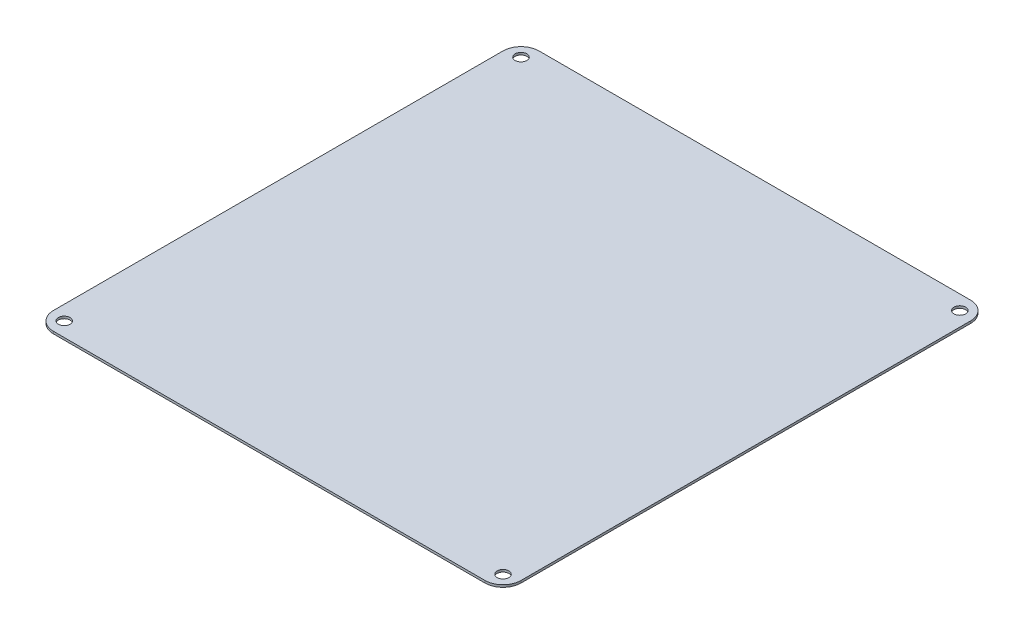
ISO-10303-21;
HEADER;
FILE_DESCRIPTION(('STEP AP214'),'2;1');
FILE_NAME('part.step','',(''),(''),'','','');
FILE_SCHEMA(('AUTOMOTIVE_DESIGN { 1 0 10303 214 1 1 1 1 }'));
ENDSEC;
DATA;
#1=APPLICATION_CONTEXT('core data for automotive mechanical design processes');
#2=APPLICATION_PROTOCOL_DEFINITION('international standard','automotive_design',2000,#1);
#3=PRODUCT_CONTEXT('',#1,'mechanical');
#4=PRODUCT('Part','Part','',(#3));
#5=PRODUCT_RELATED_PRODUCT_CATEGORY('part','',(#4));
#6=PRODUCT_DEFINITION_FORMATION('','',#4);
#7=PRODUCT_DEFINITION_CONTEXT('part definition',#1,'design');
#8=PRODUCT_DEFINITION('design','',#6,#7);
#9=PRODUCT_DEFINITION_SHAPE('','',#8);
#10=(LENGTH_UNIT() NAMED_UNIT(*) SI_UNIT(.MILLI.,.METRE.));
#11=(NAMED_UNIT(*) PLANE_ANGLE_UNIT() SI_UNIT($,.RADIAN.));
#12=(NAMED_UNIT(*) SI_UNIT($,.STERADIAN.) SOLID_ANGLE_UNIT());
#13=UNCERTAINTY_MEASURE_WITH_UNIT(LENGTH_MEASURE(1.E-05),#10,'distance_accuracy_value','');
#14=(GEOMETRIC_REPRESENTATION_CONTEXT(3) GLOBAL_UNCERTAINTY_ASSIGNED_CONTEXT((#13)) GLOBAL_UNIT_ASSIGNED_CONTEXT((#10,
#11,#12)) REPRESENTATION_CONTEXT('',''));
#15=CARTESIAN_POINT('',(0.,0.,0.));
#16=DIRECTION('',(0.,0.,1.));
#17=DIRECTION('',(1.,0.,0.));
#18=AXIS2_PLACEMENT_3D('',#15,#16,#17);
#19=CARTESIAN_POINT('',(-130.,1.27,135.));
#20=DIRECTION('',(1.,0.,0.));
#21=DIRECTION('',(0.,0.,-1.));
#22=AXIS2_PLACEMENT_3D('',#19,#20,#21);
#23=PLANE('',#22);
#24=DIRECTION('',(0.,0.,1.));
#25=VECTOR('',#24,1.);
#26=CARTESIAN_POINT('',(-130.,0.,135.));
#27=LINE('',#26,#25);
#28=CARTESIAN_POINT('',(-130.,0.,-125.));
#29=VERTEX_POINT('',#28);
#30=CARTESIAN_POINT('',(-130.,0.,125.));
#31=VERTEX_POINT('',#30);
#32=EDGE_CURVE('E130',#29,#31,#27,.T.);
#33=ORIENTED_EDGE('',*,*,#32,.T.);
#34=DIRECTION('',(0.,-1.,0.));
#35=VECTOR('',#34,1.);
#36=CARTESIAN_POINT('',(-130.,1.27,125.));
#37=LINE('',#36,#35);
#38=CARTESIAN_POINT('',(-130.,1.27,125.));
#39=VERTEX_POINT('',#38);
#40=EDGE_CURVE('E152',#31,#39,#37,.F.);
#41=ORIENTED_EDGE('',*,*,#40,.T.);
#42=DIRECTION('',(0.,0.,1.));
#43=VECTOR('',#42,1.);
#44=CARTESIAN_POINT('',(-130.,1.27,135.));
#45=LINE('',#44,#43);
#46=CARTESIAN_POINT('',(-130.,1.27,-125.));
#47=VERTEX_POINT('',#46);
#48=EDGE_CURVE('E128',#47,#39,#45,.T.);
#49=ORIENTED_EDGE('',*,*,#48,.F.);
#50=DIRECTION('',(0.,-1.,0.));
#51=VECTOR('',#50,1.);
#52=CARTESIAN_POINT('',(-130.,1.27,-125.));
#53=LINE('',#52,#51);
#54=EDGE_CURVE('E149',#47,#29,#53,.T.);
#55=ORIENTED_EDGE('',*,*,#54,.T.);
#56=EDGE_LOOP('',(#33,#41,#49,#55));
#57=FACE_BOUND('',#56,.T.);
#58=ADVANCED_FACE('F33',(#57),#23,.F.);
#59=CARTESIAN_POINT('',(130.,1.27,135.));
#60=DIRECTION('',(0.,0.,-1.));
#61=DIRECTION('',(-1.,0.,0.));
#62=AXIS2_PLACEMENT_3D('',#59,#60,#61);
#63=PLANE('',#62);
#64=DIRECTION('',(1.,0.,0.));
#65=VECTOR('',#64,1.);
#66=CARTESIAN_POINT('',(130.,0.,135.));
#67=LINE('',#66,#65);
#68=CARTESIAN_POINT('',(-120.,0.,135.));
#69=VERTEX_POINT('',#68);
#70=CARTESIAN_POINT('',(120.,0.,135.));
#71=VERTEX_POINT('',#70);
#72=EDGE_CURVE('E126',#69,#71,#67,.T.);
#73=ORIENTED_EDGE('',*,*,#72,.T.);
#74=DIRECTION('',(0.,-1.,0.));
#75=VECTOR('',#74,1.);
#76=CARTESIAN_POINT('',(120.,1.27,135.));
#77=LINE('',#76,#75);
#78=CARTESIAN_POINT('',(120.,1.27,135.));
#79=VERTEX_POINT('',#78);
#80=EDGE_CURVE('E104',#71,#79,#77,.F.);
#81=ORIENTED_EDGE('',*,*,#80,.T.);
#82=DIRECTION('',(1.,0.,0.));
#83=VECTOR('',#82,1.);
#84=CARTESIAN_POINT('',(130.,1.27,135.));
#85=LINE('',#84,#83);
#86=CARTESIAN_POINT('',(-120.,1.27,135.));
#87=VERTEX_POINT('',#86);
#88=EDGE_CURVE('E166',#87,#79,#85,.T.);
#89=ORIENTED_EDGE('',*,*,#88,.F.);
#90=DIRECTION('',(0.,-1.,0.));
#91=VECTOR('',#90,1.);
#92=CARTESIAN_POINT('',(-120.,1.27,135.));
#93=LINE('',#92,#91);
#94=EDGE_CURVE('E109',#87,#69,#93,.T.);
#95=ORIENTED_EDGE('',*,*,#94,.T.);
#96=EDGE_LOOP('',(#73,#81,#89,#95));
#97=FACE_BOUND('',#96,.T.);
#98=ADVANCED_FACE('F171',(#97),#63,.F.);
#99=CARTESIAN_POINT('',(130.,1.27,135.));
#100=DIRECTION('',(-1.,0.,0.));
#101=DIRECTION('',(0.,0.,1.));
#102=AXIS2_PLACEMENT_3D('',#99,#100,#101);
#103=PLANE('',#102);
#104=DIRECTION('',(0.,0.,-1.));
#105=VECTOR('',#104,1.);
#106=CARTESIAN_POINT('',(130.,1.27,135.));
#107=LINE('',#106,#105);
#108=CARTESIAN_POINT('',(130.,1.27,125.));
#109=VERTEX_POINT('',#108);
#110=CARTESIAN_POINT('',(130.,1.27,-125.));
#111=VERTEX_POINT('',#110);
#112=EDGE_CURVE('E118',#109,#111,#107,.T.);
#113=ORIENTED_EDGE('',*,*,#112,.F.);
#114=DIRECTION('',(0.,-1.,0.));
#115=VECTOR('',#114,1.);
#116=CARTESIAN_POINT('',(130.,1.27,125.));
#117=LINE('',#116,#115);
#118=CARTESIAN_POINT('',(130.,0.,125.));
#119=VERTEX_POINT('',#118);
#120=EDGE_CURVE('E103',#109,#119,#117,.T.);
#121=ORIENTED_EDGE('',*,*,#120,.T.);
#122=DIRECTION('',(0.,0.,-1.));
#123=VECTOR('',#122,1.);
#124=CARTESIAN_POINT('',(130.,0.,135.));
#125=LINE('',#124,#123);
#126=CARTESIAN_POINT('',(130.,0.,-125.));
#127=VERTEX_POINT('',#126);
#128=EDGE_CURVE('E116',#119,#127,#125,.T.);
#129=ORIENTED_EDGE('',*,*,#128,.T.);
#130=DIRECTION('',(0.,-1.,0.));
#131=VECTOR('',#130,1.);
#132=CARTESIAN_POINT('',(130.,1.27,-125.));
#133=LINE('',#132,#131);
#134=EDGE_CURVE('E120',#127,#111,#133,.F.);
#135=ORIENTED_EDGE('',*,*,#134,.T.);
#136=EDGE_LOOP('',(#113,#121,#129,#135));
#137=FACE_BOUND('',#136,.T.);
#138=ADVANCED_FACE('F115',(#137),#103,.F.);
#139=CARTESIAN_POINT('',(130.,1.27,-135.));
#140=DIRECTION('',(0.,0.,1.));
#141=DIRECTION('',(1.,0.,0.));
#142=AXIS2_PLACEMENT_3D('',#139,#140,#141);
#143=PLANE('',#142);
#144=DIRECTION('',(-1.,0.,0.));
#145=VECTOR('',#144,1.);
#146=CARTESIAN_POINT('',(130.,1.27,-135.));
#147=LINE('',#146,#145);
#148=CARTESIAN_POINT('',(120.,1.27,-135.));
#149=VERTEX_POINT('',#148);
#150=CARTESIAN_POINT('',(-120.,1.27,-135.));
#151=VERTEX_POINT('',#150);
#152=EDGE_CURVE('E134',#149,#151,#147,.T.);
#153=ORIENTED_EDGE('',*,*,#152,.F.);
#154=DIRECTION('',(0.,-1.,0.));
#155=VECTOR('',#154,1.);
#156=CARTESIAN_POINT('',(120.,1.27,-135.));
#157=LINE('',#156,#155);
#158=CARTESIAN_POINT('',(120.,0.,-135.));
#159=VERTEX_POINT('',#158);
#160=EDGE_CURVE('E11',#149,#159,#157,.T.);
#161=ORIENTED_EDGE('',*,*,#160,.T.);
#162=DIRECTION('',(-1.,0.,0.));
#163=VECTOR('',#162,1.);
#164=CARTESIAN_POINT('',(130.,0.,-135.));
#165=LINE('',#164,#163);
#166=CARTESIAN_POINT('',(-120.,0.,-135.));
#167=VERTEX_POINT('',#166);
#168=EDGE_CURVE('E125',#159,#167,#165,.T.);
#169=ORIENTED_EDGE('',*,*,#168,.T.);
#170=DIRECTION('',(0.,-1.,0.));
#171=VECTOR('',#170,1.);
#172=CARTESIAN_POINT('',(-120.,1.27,-135.));
#173=LINE('',#172,#171);
#174=EDGE_CURVE('E41',#167,#151,#173,.F.);
#175=ORIENTED_EDGE('',*,*,#174,.T.);
#176=EDGE_LOOP('',(#153,#161,#169,#175));
#177=FACE_BOUND('',#176,.T.);
#178=ADVANCED_FACE('F213',(#177),#143,.F.);
#179=CARTESIAN_POINT('',(0.,1.27,0.));
#180=DIRECTION('',(0.,1.,0.));
#181=DIRECTION('',(0.,0.,1.));
#182=AXIS2_PLACEMENT_3D('',#179,#180,#181);
#183=PLANE('',#182);
#184=CARTESIAN_POINT('',(-122.,1.27,127.));
#185=DIRECTION('',(0.,1.,0.));
#186=DIRECTION('',(0.,0.,1.));
#187=AXIS2_PLACEMENT_3D('',#184,#185,#186);
#188=CIRCLE('',#187,3.25000000000001);
#189=CARTESIAN_POINT('',(-122.,1.27,130.25));
#190=VERTEX_POINT('',#189);
#191=EDGE_CURVE('E183',#190,#190,#188,.T.);
#192=ORIENTED_EDGE('',*,*,#191,.F.);
#193=EDGE_LOOP('',(#192));
#194=FACE_BOUND('',#193,.T.);
#195=CARTESIAN_POINT('',(122.,1.27,127.));
#196=DIRECTION('',(0.,1.,0.));
#197=DIRECTION('',(0.,0.,1.));
#198=AXIS2_PLACEMENT_3D('',#195,#196,#197);
#199=CIRCLE('',#198,3.25000000000001);
#200=CARTESIAN_POINT('',(122.,1.27,130.25));
#201=VERTEX_POINT('',#200);
#202=EDGE_CURVE('E189',#201,#201,#199,.T.);
#203=ORIENTED_EDGE('',*,*,#202,.F.);
#204=EDGE_LOOP('',(#203));
#205=FACE_BOUND('',#204,.T.);
#206=CARTESIAN_POINT('',(122.,1.27,-127.));
#207=DIRECTION('',(0.,1.,0.));
#208=DIRECTION('',(0.,0.,1.));
#209=AXIS2_PLACEMENT_3D('',#206,#207,#208);
#210=CIRCLE('',#209,3.25000000000002);
#211=CARTESIAN_POINT('',(122.,1.27,-123.75));
#212=VERTEX_POINT('',#211);
#213=EDGE_CURVE('E195',#212,#212,#210,.T.);
#214=ORIENTED_EDGE('',*,*,#213,.F.);
#215=EDGE_LOOP('',(#214));
#216=FACE_BOUND('',#215,.T.);
#217=CARTESIAN_POINT('',(-122.,1.27,-127.));
#218=DIRECTION('',(0.,1.,0.));
#219=DIRECTION('',(0.,0.,1.));
#220=AXIS2_PLACEMENT_3D('',#217,#218,#219);
#221=CIRCLE('',#220,3.25000000000001);
#222=CARTESIAN_POINT('',(-122.,1.27,-123.75));
#223=VERTEX_POINT('',#222);
#224=EDGE_CURVE('E174',#223,#223,#221,.T.);
#225=ORIENTED_EDGE('',*,*,#224,.F.);
#226=EDGE_LOOP('',(#225));
#227=FACE_BOUND('',#226,.T.);
#228=ORIENTED_EDGE('',*,*,#88,.T.);
#229=CARTESIAN_POINT('',(120.,1.27,125.));
#230=DIRECTION('',(0.,1.,0.));
#231=DIRECTION('',(0.,0.,1.));
#232=AXIS2_PLACEMENT_3D('',#229,#230,#231);
#233=CIRCLE('',#232,10.);
#234=EDGE_CURVE('E147',#79,#109,#233,.T.);
#235=ORIENTED_EDGE('',*,*,#234,.T.);
#236=ORIENTED_EDGE('',*,*,#112,.T.);
#237=CARTESIAN_POINT('',(120.,1.27,-125.));
#238=DIRECTION('',(0.,1.,0.));
#239=DIRECTION('',(0.,0.,1.));
#240=AXIS2_PLACEMENT_3D('',#237,#238,#239);
#241=CIRCLE('',#240,10.);
#242=EDGE_CURVE('E54',#111,#149,#241,.T.);
#243=ORIENTED_EDGE('',*,*,#242,.T.);
#244=ORIENTED_EDGE('',*,*,#152,.T.);
#245=CARTESIAN_POINT('',(-120.,1.27,-125.));
#246=DIRECTION('',(0.,1.,0.));
#247=DIRECTION('',(0.,0.,1.));
#248=AXIS2_PLACEMENT_3D('',#245,#246,#247);
#249=CIRCLE('',#248,10.);
#250=EDGE_CURVE('E142',#151,#47,#249,.T.);
#251=ORIENTED_EDGE('',*,*,#250,.T.);
#252=ORIENTED_EDGE('',*,*,#48,.T.);
#253=CARTESIAN_POINT('',(-120.,1.27,125.));
#254=DIRECTION('',(0.,1.,0.));
#255=DIRECTION('',(0.,0.,1.));
#256=AXIS2_PLACEMENT_3D('',#253,#254,#255);
#257=CIRCLE('',#256,10.);
#258=EDGE_CURVE('E145',#39,#87,#257,.T.);
#259=ORIENTED_EDGE('',*,*,#258,.T.);
#260=EDGE_LOOP('',(#228,#235,#236,#243,#244,#251,#252,#259));
#261=FACE_BOUND('',#260,.T.);
#262=ADVANCED_FACE('F163',(#194,#205,#216,#227,#261),#183,.T.);
#263=CARTESIAN_POINT('',(0.,0.,0.));
#264=DIRECTION('',(0.,1.,0.));
#265=DIRECTION('',(0.,0.,1.));
#266=AXIS2_PLACEMENT_3D('',#263,#264,#265);
#267=PLANE('',#266);
#268=CARTESIAN_POINT('',(-122.,0.,127.));
#269=DIRECTION('',(0.,1.,0.));
#270=DIRECTION('',(0.,0.,1.));
#271=AXIS2_PLACEMENT_3D('',#268,#269,#270);
#272=CIRCLE('',#271,3.25000000000001);
#273=CARTESIAN_POINT('',(-122.,0.,130.25));
#274=VERTEX_POINT('',#273);
#275=EDGE_CURVE('E186',#274,#274,#272,.T.);
#276=ORIENTED_EDGE('',*,*,#275,.T.);
#277=EDGE_LOOP('',(#276));
#278=FACE_BOUND('',#277,.T.);
#279=CARTESIAN_POINT('',(122.,0.,127.));
#280=DIRECTION('',(0.,1.,0.));
#281=DIRECTION('',(0.,0.,1.));
#282=AXIS2_PLACEMENT_3D('',#279,#280,#281);
#283=CIRCLE('',#282,3.25000000000001);
#284=CARTESIAN_POINT('',(122.,0.,130.25));
#285=VERTEX_POINT('',#284);
#286=EDGE_CURVE('E192',#285,#285,#283,.T.);
#287=ORIENTED_EDGE('',*,*,#286,.T.);
#288=EDGE_LOOP('',(#287));
#289=FACE_BOUND('',#288,.T.);
#290=CARTESIAN_POINT('',(122.,0.,-127.));
#291=DIRECTION('',(0.,1.,0.));
#292=DIRECTION('',(0.,0.,1.));
#293=AXIS2_PLACEMENT_3D('',#290,#291,#292);
#294=CIRCLE('',#293,3.25000000000002);
#295=CARTESIAN_POINT('',(122.,0.,-123.75));
#296=VERTEX_POINT('',#295);
#297=EDGE_CURVE('E181',#296,#296,#294,.T.);
#298=ORIENTED_EDGE('',*,*,#297,.T.);
#299=EDGE_LOOP('',(#298));
#300=FACE_BOUND('',#299,.T.);
#301=CARTESIAN_POINT('',(-122.,0.,-127.));
#302=DIRECTION('',(0.,1.,0.));
#303=DIRECTION('',(0.,0.,1.));
#304=AXIS2_PLACEMENT_3D('',#301,#302,#303);
#305=CIRCLE('',#304,3.25000000000001);
#306=CARTESIAN_POINT('',(-122.,0.,-123.75));
#307=VERTEX_POINT('',#306);
#308=EDGE_CURVE('E172',#307,#307,#305,.T.);
#309=ORIENTED_EDGE('',*,*,#308,.T.);
#310=EDGE_LOOP('',(#309));
#311=FACE_BOUND('',#310,.T.);
#312=ORIENTED_EDGE('',*,*,#128,.F.);
#313=CARTESIAN_POINT('',(120.,0.,125.));
#314=DIRECTION('',(0.,1.,0.));
#315=DIRECTION('',(0.,0.,1.));
#316=AXIS2_PLACEMENT_3D('',#313,#314,#315);
#317=CIRCLE('',#316,10.);
#318=EDGE_CURVE('E99',#119,#71,#317,.F.);
#319=ORIENTED_EDGE('',*,*,#318,.T.);
#320=ORIENTED_EDGE('',*,*,#72,.F.);
#321=CARTESIAN_POINT('',(-120.,0.,125.));
#322=DIRECTION('',(0.,1.,0.));
#323=DIRECTION('',(0.,0.,1.));
#324=AXIS2_PLACEMENT_3D('',#321,#322,#323);
#325=CIRCLE('',#324,10.);
#326=EDGE_CURVE('E110',#69,#31,#325,.F.);
#327=ORIENTED_EDGE('',*,*,#326,.T.);
#328=ORIENTED_EDGE('',*,*,#32,.F.);
#329=CARTESIAN_POINT('',(-120.,0.,-125.));
#330=DIRECTION('',(0.,1.,0.));
#331=DIRECTION('',(0.,0.,1.));
#332=AXIS2_PLACEMENT_3D('',#329,#330,#331);
#333=CIRCLE('',#332,10.);
#334=EDGE_CURVE('E119',#29,#167,#333,.F.);
#335=ORIENTED_EDGE('',*,*,#334,.T.);
#336=ORIENTED_EDGE('',*,*,#168,.F.);
#337=CARTESIAN_POINT('',(120.,0.,-125.));
#338=DIRECTION('',(0.,1.,0.));
#339=DIRECTION('',(0.,0.,1.));
#340=AXIS2_PLACEMENT_3D('',#337,#338,#339);
#341=CIRCLE('',#340,10.);
#342=EDGE_CURVE('E124',#159,#127,#341,.F.);
#343=ORIENTED_EDGE('',*,*,#342,.T.);
#344=EDGE_LOOP('',(#312,#319,#320,#327,#328,#335,#336,#343));
#345=FACE_BOUND('',#344,.T.);
#346=ADVANCED_FACE('F122',(#278,#289,#300,#311,#345),#267,.F.);
#347=CARTESIAN_POINT('',(-122.,0.,-127.));
#348=DIRECTION('',(0.,1.,0.));
#349=DIRECTION('',(0.,0.,1.));
#350=AXIS2_PLACEMENT_3D('',#347,#348,#349);
#351=CYLINDRICAL_SURFACE('',#350,3.25000000000001);
#352=ORIENTED_EDGE('',*,*,#308,.F.);
#353=EDGE_LOOP('',(#352));
#354=FACE_BOUND('',#353,.T.);
#355=ORIENTED_EDGE('',*,*,#224,.T.);
#356=EDGE_LOOP('',(#355));
#357=FACE_BOUND('',#356,.T.);
#358=ADVANCED_FACE('F207',(#354,#357),#351,.F.);
#359=CARTESIAN_POINT('',(122.,0.,-127.));
#360=DIRECTION('',(0.,1.,0.));
#361=DIRECTION('',(0.,0.,1.));
#362=AXIS2_PLACEMENT_3D('',#359,#360,#361);
#363=CYLINDRICAL_SURFACE('',#362,3.25000000000002);
#364=ORIENTED_EDGE('',*,*,#297,.F.);
#365=EDGE_LOOP('',(#364));
#366=FACE_BOUND('',#365,.T.);
#367=ORIENTED_EDGE('',*,*,#213,.T.);
#368=EDGE_LOOP('',(#367));
#369=FACE_BOUND('',#368,.T.);
#370=ADVANCED_FACE('F203',(#366,#369),#363,.F.);
#371=CARTESIAN_POINT('',(122.,0.,127.));
#372=DIRECTION('',(0.,1.,0.));
#373=DIRECTION('',(0.,0.,1.));
#374=AXIS2_PLACEMENT_3D('',#371,#372,#373);
#375=CYLINDRICAL_SURFACE('',#374,3.25000000000001);
#376=ORIENTED_EDGE('',*,*,#286,.F.);
#377=EDGE_LOOP('',(#376));
#378=FACE_BOUND('',#377,.T.);
#379=ORIENTED_EDGE('',*,*,#202,.T.);
#380=EDGE_LOOP('',(#379));
#381=FACE_BOUND('',#380,.T.);
#382=ADVANCED_FACE('F206',(#378,#381),#375,.F.);
#383=CARTESIAN_POINT('',(-122.,0.,127.));
#384=DIRECTION('',(0.,1.,0.));
#385=DIRECTION('',(0.,0.,1.));
#386=AXIS2_PLACEMENT_3D('',#383,#384,#385);
#387=CYLINDRICAL_SURFACE('',#386,3.25000000000001);
#388=ORIENTED_EDGE('',*,*,#275,.F.);
#389=EDGE_LOOP('',(#388));
#390=FACE_BOUND('',#389,.T.);
#391=ORIENTED_EDGE('',*,*,#191,.T.);
#392=EDGE_LOOP('',(#391));
#393=FACE_BOUND('',#392,.T.);
#394=ADVANCED_FACE('F238',(#390,#393),#387,.F.);
#395=CARTESIAN_POINT('',(120.,1.27,125.));
#396=DIRECTION('',(0.,-1.,0.));
#397=DIRECTION('',(0.,0.,-1.));
#398=AXIS2_PLACEMENT_3D('',#395,#396,#397);
#399=CYLINDRICAL_SURFACE('',#398,10.);
#400=ORIENTED_EDGE('',*,*,#234,.F.);
#401=ORIENTED_EDGE('',*,*,#80,.F.);
#402=ORIENTED_EDGE('',*,*,#318,.F.);
#403=ORIENTED_EDGE('',*,*,#120,.F.);
#404=EDGE_LOOP('',(#400,#401,#402,#403));
#405=FACE_BOUND('',#404,.T.);
#406=ADVANCED_FACE('F102',(#405),#399,.T.);
#407=CARTESIAN_POINT('',(-120.,1.27,125.));
#408=DIRECTION('',(0.,-1.,0.));
#409=DIRECTION('',(0.,0.,-1.));
#410=AXIS2_PLACEMENT_3D('',#407,#408,#409);
#411=CYLINDRICAL_SURFACE('',#410,10.);
#412=ORIENTED_EDGE('',*,*,#258,.F.);
#413=ORIENTED_EDGE('',*,*,#40,.F.);
#414=ORIENTED_EDGE('',*,*,#326,.F.);
#415=ORIENTED_EDGE('',*,*,#94,.F.);
#416=EDGE_LOOP('',(#412,#413,#414,#415));
#417=FACE_BOUND('',#416,.T.);
#418=ADVANCED_FACE('F169',(#417),#411,.T.);
#419=CARTESIAN_POINT('',(120.,1.27,-125.));
#420=DIRECTION('',(0.,-1.,0.));
#421=DIRECTION('',(0.,0.,-1.));
#422=AXIS2_PLACEMENT_3D('',#419,#420,#421);
#423=CYLINDRICAL_SURFACE('',#422,10.);
#424=ORIENTED_EDGE('',*,*,#242,.F.);
#425=ORIENTED_EDGE('',*,*,#134,.F.);
#426=ORIENTED_EDGE('',*,*,#342,.F.);
#427=ORIENTED_EDGE('',*,*,#160,.F.);
#428=EDGE_LOOP('',(#424,#425,#426,#427));
#429=FACE_BOUND('',#428,.T.);
#430=ADVANCED_FACE('F240',(#429),#423,.T.);
#431=CARTESIAN_POINT('',(-120.,1.27,-125.));
#432=DIRECTION('',(0.,-1.,0.));
#433=DIRECTION('',(0.,0.,-1.));
#434=AXIS2_PLACEMENT_3D('',#431,#432,#433);
#435=CYLINDRICAL_SURFACE('',#434,10.);
#436=ORIENTED_EDGE('',*,*,#250,.F.);
#437=ORIENTED_EDGE('',*,*,#174,.F.);
#438=ORIENTED_EDGE('',*,*,#334,.F.);
#439=ORIENTED_EDGE('',*,*,#54,.F.);
#440=EDGE_LOOP('',(#436,#437,#438,#439));
#441=FACE_BOUND('',#440,.T.);
#442=ADVANCED_FACE('F35',(#441),#435,.T.);
#443=CLOSED_SHELL('',(#58,#98,#138,#178,#262,#346,#358,#370,#382,#394,#406,#418,#430,#442));
#444=MANIFOLD_SOLID_BREP('B2',#443);
#445=ADVANCED_BREP_SHAPE_REPRESENTATION('',(#18,#444),#14);
#446=SHAPE_DEFINITION_REPRESENTATION(#9,#445);
ENDSEC;
END-ISO-10303-21;
